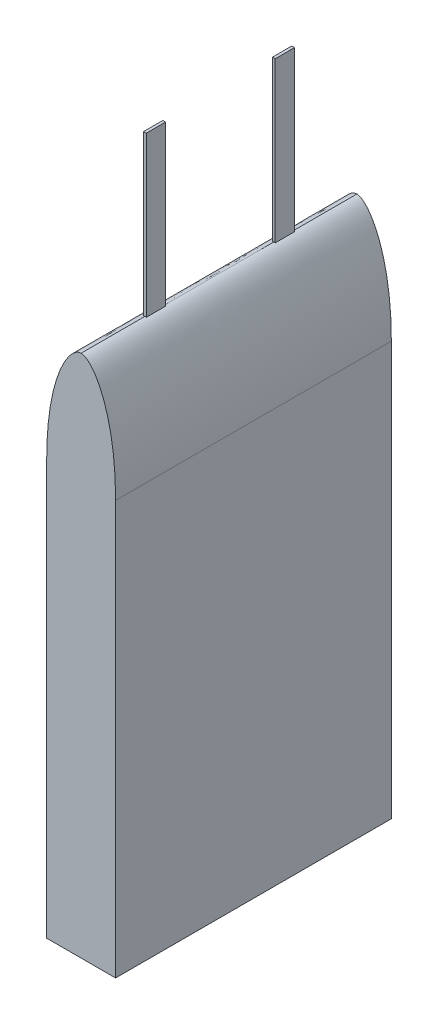
ISO-10303-21;
HEADER;
FILE_DESCRIPTION(('STEP AP214'),'2;1');
FILE_NAME('part.step','',(''),(''),'','','');
FILE_SCHEMA(('AUTOMOTIVE_DESIGN { 1 0 10303 214 1 1 1 1 }'));
ENDSEC;
DATA;
#1=APPLICATION_CONTEXT('core data for automotive mechanical design processes');
#2=APPLICATION_PROTOCOL_DEFINITION('international standard','automotive_design',2000,#1);
#3=PRODUCT_CONTEXT('',#1,'mechanical');
#4=PRODUCT('Part','Part','',(#3));
#5=PRODUCT_RELATED_PRODUCT_CATEGORY('part','',(#4));
#6=PRODUCT_DEFINITION_FORMATION('','',#4);
#7=PRODUCT_DEFINITION_CONTEXT('part definition',#1,'design');
#8=PRODUCT_DEFINITION('design','',#6,#7);
#9=PRODUCT_DEFINITION_SHAPE('','',#8);
#10=(LENGTH_UNIT() NAMED_UNIT(*) SI_UNIT(.MILLI.,.METRE.));
#11=(NAMED_UNIT(*) PLANE_ANGLE_UNIT() SI_UNIT($,.RADIAN.));
#12=(NAMED_UNIT(*) SI_UNIT($,.STERADIAN.) SOLID_ANGLE_UNIT());
#13=UNCERTAINTY_MEASURE_WITH_UNIT(LENGTH_MEASURE(1.E-05),#10,'distance_accuracy_value','');
#14=(GEOMETRIC_REPRESENTATION_CONTEXT(3) GLOBAL_UNCERTAINTY_ASSIGNED_CONTEXT((#13)) GLOBAL_UNIT_ASSIGNED_CONTEXT((#10,
#11,#12)) REPRESENTATION_CONTEXT('',''));
#15=CARTESIAN_POINT('',(0.,0.,0.));
#16=DIRECTION('',(0.,0.,1.));
#17=DIRECTION('',(1.,0.,0.));
#18=AXIS2_PLACEMENT_3D('',#15,#16,#17);
#19=CARTESIAN_POINT('',(5.,15.,-10.));
#20=DIRECTION('',(0.,0.,1.));
#21=DIRECTION('',(0.,-1.,0.));
#22=AXIS2_PLACEMENT_3D('',#19,#20,#21);
#23=PLANE('',#22);
#24=DIRECTION('',(0.,1.,0.));
#25=VECTOR('',#24,1.);
#26=CARTESIAN_POINT('',(0.,15.,-10.));
#27=LINE('',#26,#25);
#28=CARTESIAN_POINT('',(0.,-15.,-10.));
#29=VERTEX_POINT('',#28);
#30=CARTESIAN_POINT('',(0.,15.,-10.));
#31=VERTEX_POINT('',#30);
#32=EDGE_CURVE('E292',#29,#31,#27,.T.);
#33=ORIENTED_EDGE('',*,*,#32,.T.);
#34=CARTESIAN_POINT('',(2.5,22.9979471811532,-10.));
#35=CARTESIAN_POINT('',(1.66342165329432,22.9995894001905,-10.));
#36=CARTESIAN_POINT('',(-0.00576145306257891,20.5485259391372,-10.));
#37=CARTESIAN_POINT('',(0.,15.,-10.));
#38=B_SPLINE_CURVE_WITH_KNOTS('',3,(#34,#35,#36,#37),.UNSPECIFIED.,.F.,.F.,(4,4),(0.,1.),.UNSPECIFIED.);
#39=CARTESIAN_POINT('',(2.5,22.9979471811532,-10.));
#40=VERTEX_POINT('',#39);
#41=EDGE_CURVE('E230',#40,#31,#38,.T.);
#42=ORIENTED_EDGE('',*,*,#41,.F.);
#43=CARTESIAN_POINT('',(5.,15.,-10.));
#44=CARTESIAN_POINT('',(5.00576145306258,20.5485259391372,-10.));
#45=CARTESIAN_POINT('',(3.33657834670568,22.9995894001905,-10.));
#46=CARTESIAN_POINT('',(2.5,22.9979471811532,-10.));
#47=B_SPLINE_CURVE_WITH_KNOTS('',3,(#43,#44,#45,#46),.UNSPECIFIED.,.F.,.F.,(4,4),(0.,1.),.UNSPECIFIED.);
#48=CARTESIAN_POINT('',(5.,15.,-10.));
#49=VERTEX_POINT('',#48);
#50=EDGE_CURVE('E239',#49,#40,#47,.T.);
#51=ORIENTED_EDGE('',*,*,#50,.F.);
#52=DIRECTION('',(0.,1.,0.));
#53=VECTOR('',#52,1.);
#54=CARTESIAN_POINT('',(5.,15.,-10.));
#55=LINE('',#54,#53);
#56=CARTESIAN_POINT('',(5.,-15.,-10.));
#57=VERTEX_POINT('',#56);
#58=EDGE_CURVE('E293',#57,#49,#55,.T.);
#59=ORIENTED_EDGE('',*,*,#58,.F.);
#60=DIRECTION('',(-1.,0.,0.));
#61=VECTOR('',#60,1.);
#62=CARTESIAN_POINT('',(5.,-15.,-10.));
#63=LINE('',#62,#61);
#64=EDGE_CURVE('E288',#57,#29,#63,.T.);
#65=ORIENTED_EDGE('',*,*,#64,.T.);
#66=EDGE_LOOP('',(#33,#42,#51,#59,#65));
#67=FACE_BOUND('',#66,.T.);
#68=ADVANCED_FACE('F32',(#67),#23,.F.);
#69=CARTESIAN_POINT('',(5.,15.,10.));
#70=DIRECTION('',(0.,0.,-1.));
#71=DIRECTION('',(0.,1.,0.));
#72=AXIS2_PLACEMENT_3D('',#69,#70,#71);
#73=PLANE('',#72);
#74=DIRECTION('',(0.,-1.,0.));
#75=VECTOR('',#74,1.);
#76=CARTESIAN_POINT('',(0.,15.,10.));
#77=LINE('',#76,#75);
#78=CARTESIAN_POINT('',(0.,15.,10.));
#79=VERTEX_POINT('',#78);
#80=CARTESIAN_POINT('',(0.,-15.,10.));
#81=VERTEX_POINT('',#80);
#82=EDGE_CURVE('E273',#79,#81,#77,.T.);
#83=ORIENTED_EDGE('',*,*,#82,.T.);
#84=DIRECTION('',(-1.,0.,0.));
#85=VECTOR('',#84,1.);
#86=CARTESIAN_POINT('',(5.,-15.,10.));
#87=LINE('',#86,#85);
#88=CARTESIAN_POINT('',(5.,-15.,10.));
#89=VERTEX_POINT('',#88);
#90=EDGE_CURVE('E276',#89,#81,#87,.T.);
#91=ORIENTED_EDGE('',*,*,#90,.F.);
#92=DIRECTION('',(0.,-1.,0.));
#93=VECTOR('',#92,1.);
#94=CARTESIAN_POINT('',(5.,15.,10.));
#95=LINE('',#94,#93);
#96=CARTESIAN_POINT('',(5.,15.,10.));
#97=VERTEX_POINT('',#96);
#98=EDGE_CURVE('E343',#97,#89,#95,.T.);
#99=ORIENTED_EDGE('',*,*,#98,.F.);
#100=CARTESIAN_POINT('',(5.,15.,10.));
#101=CARTESIAN_POINT('',(5.00576145306258,20.5485259391372,10.));
#102=CARTESIAN_POINT('',(3.33657834670568,22.9995894001905,10.));
#103=CARTESIAN_POINT('',(2.5,22.9979471811532,10.));
#104=B_SPLINE_CURVE_WITH_KNOTS('',3,(#100,#101,#102,#103),.UNSPECIFIED.,.F.,.F.,(4,4),(0.,1.),.UNSPECIFIED.);
#105=CARTESIAN_POINT('',(2.5,22.9979471811532,10.));
#106=VERTEX_POINT('',#105);
#107=EDGE_CURVE('E222',#97,#106,#104,.T.);
#108=ORIENTED_EDGE('',*,*,#107,.T.);
#109=CARTESIAN_POINT('',(2.5,22.9979471811532,10.));
#110=CARTESIAN_POINT('',(1.66342165329432,22.9995894001905,10.));
#111=CARTESIAN_POINT('',(-0.00576145306257891,20.5485259391372,10.));
#112=CARTESIAN_POINT('',(0.,15.,10.));
#113=B_SPLINE_CURVE_WITH_KNOTS('',3,(#109,#110,#111,#112),.UNSPECIFIED.,.F.,.F.,(4,4),(0.,1.),.UNSPECIFIED.);
#114=EDGE_CURVE('E214',#106,#79,#113,.T.);
#115=ORIENTED_EDGE('',*,*,#114,.T.);
#116=EDGE_LOOP('',(#83,#91,#99,#108,#115));
#117=FACE_BOUND('',#116,.T.);
#118=ADVANCED_FACE('F264',(#117),#73,.F.);
#119=CARTESIAN_POINT('',(5.,-15.,10.));
#120=DIRECTION('',(0.,1.,0.));
#121=DIRECTION('',(0.,0.,1.));
#122=AXIS2_PLACEMENT_3D('',#119,#120,#121);
#123=PLANE('',#122);
#124=DIRECTION('',(0.,0.,-1.));
#125=VECTOR('',#124,1.);
#126=CARTESIAN_POINT('',(0.,-15.,10.));
#127=LINE('',#126,#125);
#128=EDGE_CURVE('E281',#81,#29,#127,.T.);
#129=ORIENTED_EDGE('',*,*,#128,.T.);
#130=ORIENTED_EDGE('',*,*,#64,.F.);
#131=DIRECTION('',(0.,0.,-1.));
#132=VECTOR('',#131,1.);
#133=CARTESIAN_POINT('',(5.,-15.,10.));
#134=LINE('',#133,#132);
#135=EDGE_CURVE('E286',#89,#57,#134,.T.);
#136=ORIENTED_EDGE('',*,*,#135,.F.);
#137=ORIENTED_EDGE('',*,*,#90,.T.);
#138=EDGE_LOOP('',(#129,#130,#136,#137));
#139=FACE_BOUND('',#138,.T.);
#140=ADVANCED_FACE('F258',(#139),#123,.F.);
#141=CARTESIAN_POINT('',(5.,0.,0.));
#142=DIRECTION('',(1.,0.,0.));
#143=DIRECTION('',(0.,0.,-1.));
#144=AXIS2_PLACEMENT_3D('',#141,#142,#143);
#145=PLANE('',#144);
#146=ORIENTED_EDGE('',*,*,#58,.T.);
#147=DIRECTION('',(0.,0.,1.));
#148=VECTOR('',#147,1.);
#149=CARTESIAN_POINT('',(5.,15.,10.));
#150=LINE('',#149,#148);
#151=EDGE_CURVE('E295',#49,#97,#150,.T.);
#152=ORIENTED_EDGE('',*,*,#151,.T.);
#153=ORIENTED_EDGE('',*,*,#98,.T.);
#154=ORIENTED_EDGE('',*,*,#135,.T.);
#155=EDGE_LOOP('',(#146,#152,#153,#154));
#156=FACE_BOUND('',#155,.T.);
#157=ADVANCED_FACE('F255',(#156),#145,.T.);
#158=CARTESIAN_POINT('',(0.,0.,0.));
#159=DIRECTION('',(1.,0.,0.));
#160=DIRECTION('',(0.,0.,-1.));
#161=AXIS2_PLACEMENT_3D('',#158,#159,#160);
#162=PLANE('',#161);
#163=ORIENTED_EDGE('',*,*,#32,.F.);
#164=ORIENTED_EDGE('',*,*,#128,.F.);
#165=ORIENTED_EDGE('',*,*,#82,.F.);
#166=DIRECTION('',(0.,0.,1.));
#167=VECTOR('',#166,1.);
#168=CARTESIAN_POINT('',(0.,15.,10.));
#169=LINE('',#168,#167);
#170=EDGE_CURVE('E282',#31,#79,#169,.T.);
#171=ORIENTED_EDGE('',*,*,#170,.F.);
#172=EDGE_LOOP('',(#163,#164,#165,#171));
#173=FACE_BOUND('',#172,.T.);
#174=ADVANCED_FACE('F253',(#173),#162,.F.);
#175=DIRECTION('',(0.,0.,1.));
#176=VECTOR('',#175,1.);
#177=SURFACE_OF_LINEAR_EXTRUSION('',#38,#176);
#178=CARTESIAN_POINT('',(2.5,22.9979471811532,3.97519149448997));
#179=CARTESIAN_POINT('',(1.66342165329432,22.9995894001905,3.97519149448997));
#180=CARTESIAN_POINT('',(-0.00576145306257891,20.5485259391372,3.97519149448997));
#181=CARTESIAN_POINT('',(0.,15.,3.97519149448997));
#182=B_SPLINE_CURVE_WITH_KNOTS('',3,(#178,#179,#180,#181),.UNSPECIFIED.,.F.,.F.,(4,4),(0.,1.),.UNSPECIFIED.);
#183=CARTESIAN_POINT('',(2.5,22.9979471811532,3.97519149448997));
#184=VERTEX_POINT('',#183);
#185=CARTESIAN_POINT('',(2.4,22.9872320805278,3.97519149448997));
#186=VERTEX_POINT('',#185);
#187=EDGE_CURVE('E171',#184,#186,#182,.T.);
#188=ORIENTED_EDGE('',*,*,#187,.F.);
#189=DIRECTION('',(0.,0.,1.));
#190=VECTOR('',#189,1.);
#191=CARTESIAN_POINT('',(2.5,22.9979471811532,-10.));
#192=LINE('',#191,#190);
#193=CARTESIAN_POINT('',(2.5,22.9979471811532,-3.97519149448997));
#194=VERTEX_POINT('',#193);
#195=EDGE_CURVE('E336',#194,#184,#192,.T.);
#196=ORIENTED_EDGE('',*,*,#195,.F.);
#197=CARTESIAN_POINT('',(2.5,22.9979471811532,-3.97519149448997));
#198=CARTESIAN_POINT('',(1.66342165329432,22.9995894001905,-3.97519149448997));
#199=CARTESIAN_POINT('',(-0.00576145306257891,20.5485259391372,-3.97519149448997));
#200=CARTESIAN_POINT('',(0.,15.,-3.97519149448997));
#201=B_SPLINE_CURVE_WITH_KNOTS('',3,(#197,#198,#199,#200),.UNSPECIFIED.,.F.,.F.,(4,4),(0.,1.),.UNSPECIFIED.);
#202=CARTESIAN_POINT('',(2.4,22.9872320805278,-3.97519149448997));
#203=VERTEX_POINT('',#202);
#204=EDGE_CURVE('E200',#203,#194,#201,.F.);
#205=ORIENTED_EDGE('',*,*,#204,.F.);
#206=DIRECTION('',(0.,0.,1.));
#207=VECTOR('',#206,1.);
#208=CARTESIAN_POINT('',(2.4,22.9872320805278,-10.));
#209=LINE('',#208,#207);
#210=CARTESIAN_POINT('',(2.4,22.9872320805278,-5.37525893909022));
#211=VERTEX_POINT('',#210);
#212=EDGE_CURVE('E54',#203,#211,#209,.F.);
#213=ORIENTED_EDGE('',*,*,#212,.T.);
#214=CARTESIAN_POINT('',(2.5,22.9979471811532,-5.37525893909022));
#215=CARTESIAN_POINT('',(1.66342165329432,22.9995894001905,-5.37525893909022));
#216=CARTESIAN_POINT('',(-0.00576145306257891,20.5485259391372,-5.37525893909022));
#217=CARTESIAN_POINT('',(0.,15.,-5.37525893909022));
#218=B_SPLINE_CURVE_WITH_KNOTS('',3,(#214,#215,#216,#217),.UNSPECIFIED.,.F.,.F.,(4,4),(0.,1.),.UNSPECIFIED.);
#219=CARTESIAN_POINT('',(2.5,22.9979471811532,-5.37525893909022));
#220=VERTEX_POINT('',#219);
#221=EDGE_CURVE('E207',#220,#211,#218,.T.);
#222=ORIENTED_EDGE('',*,*,#221,.F.);
#223=EDGE_CURVE('E338',#40,#220,#192,.T.);
#224=ORIENTED_EDGE('',*,*,#223,.F.);
#225=ORIENTED_EDGE('',*,*,#41,.T.);
#226=ORIENTED_EDGE('',*,*,#170,.T.);
#227=ORIENTED_EDGE('',*,*,#114,.F.);
#228=CARTESIAN_POINT('',(2.5,22.9979471811532,5.37525893909022));
#229=VERTEX_POINT('',#228);
#230=EDGE_CURVE('E339',#229,#106,#192,.T.);
#231=ORIENTED_EDGE('',*,*,#230,.F.);
#232=CARTESIAN_POINT('',(2.5,22.9979471811532,5.37525893909022));
#233=CARTESIAN_POINT('',(1.66342165329432,22.9995894001905,5.37525893909022));
#234=CARTESIAN_POINT('',(-0.00576145306257891,20.5485259391372,5.37525893909022));
#235=CARTESIAN_POINT('',(0.,15.,5.37525893909022));
#236=B_SPLINE_CURVE_WITH_KNOTS('',3,(#232,#233,#234,#235),.UNSPECIFIED.,.F.,.F.,(4,4),(0.,1.),.UNSPECIFIED.);
#237=CARTESIAN_POINT('',(2.4,22.9872320805278,5.37525893909022));
#238=VERTEX_POINT('',#237);
#239=EDGE_CURVE('E166',#238,#229,#236,.F.);
#240=ORIENTED_EDGE('',*,*,#239,.F.);
#241=DIRECTION('',(0.,0.,1.));
#242=VECTOR('',#241,1.);
#243=CARTESIAN_POINT('',(2.4,22.9872320805278,-10.));
#244=LINE('',#243,#242);
#245=EDGE_CURVE('E11',#186,#238,#244,.T.);
#246=ORIENTED_EDGE('',*,*,#245,.F.);
#247=EDGE_LOOP('',(#188,#196,#205,#213,#222,#224,#225,#226,#227,#231,#240,#246));
#248=FACE_BOUND('',#247,.T.);
#249=ADVANCED_FACE('F248',(#248),#177,.T.);
#250=DIRECTION('',(0.,0.,1.));
#251=VECTOR('',#250,1.);
#252=SURFACE_OF_LINEAR_EXTRUSION('',#47,#251);
#253=CARTESIAN_POINT('',(5.,15.,3.97519149448997));
#254=CARTESIAN_POINT('',(5.00576145306258,20.5485259391372,3.97519149448997));
#255=CARTESIAN_POINT('',(3.33657834670568,22.9995894001905,3.97519149448997));
#256=CARTESIAN_POINT('',(2.5,22.9979471811532,3.97519149448997));
#257=B_SPLINE_CURVE_WITH_KNOTS('',3,(#253,#254,#255,#256),.UNSPECIFIED.,.F.,.F.,(4,4),(0.,1.),.UNSPECIFIED.);
#258=CARTESIAN_POINT('',(2.6,22.9872320805278,3.97519149448997));
#259=VERTEX_POINT('',#258);
#260=EDGE_CURVE('E39',#259,#184,#257,.T.);
#261=ORIENTED_EDGE('',*,*,#260,.F.);
#262=DIRECTION('',(0.,0.,1.));
#263=VECTOR('',#262,1.);
#264=CARTESIAN_POINT('',(2.6,22.9872320805278,-10.));
#265=LINE('',#264,#263);
#266=CARTESIAN_POINT('',(2.6,22.9872320805278,5.37525893909022));
#267=VERTEX_POINT('',#266);
#268=EDGE_CURVE('E142',#259,#267,#265,.T.);
#269=ORIENTED_EDGE('',*,*,#268,.T.);
#270=CARTESIAN_POINT('',(5.,15.,5.37525893909022));
#271=CARTESIAN_POINT('',(5.00576145306258,20.5485259391372,5.37525893909022));
#272=CARTESIAN_POINT('',(3.33657834670568,22.9995894001905,5.37525893909022));
#273=CARTESIAN_POINT('',(2.5,22.9979471811532,5.37525893909022));
#274=B_SPLINE_CURVE_WITH_KNOTS('',3,(#270,#271,#272,#273),.UNSPECIFIED.,.F.,.F.,(4,4),(0.,1.),.UNSPECIFIED.);
#275=EDGE_CURVE('E320',#229,#267,#274,.F.);
#276=ORIENTED_EDGE('',*,*,#275,.F.);
#277=ORIENTED_EDGE('',*,*,#230,.T.);
#278=ORIENTED_EDGE('',*,*,#107,.F.);
#279=ORIENTED_EDGE('',*,*,#151,.F.);
#280=ORIENTED_EDGE('',*,*,#50,.T.);
#281=ORIENTED_EDGE('',*,*,#223,.T.);
#282=CARTESIAN_POINT('',(5.,15.,-5.37525893909022));
#283=CARTESIAN_POINT('',(5.00576145306258,20.5485259391372,-5.37525893909022));
#284=CARTESIAN_POINT('',(3.33657834670568,22.9995894001905,-5.37525893909022));
#285=CARTESIAN_POINT('',(2.5,22.9979471811532,-5.37525893909022));
#286=B_SPLINE_CURVE_WITH_KNOTS('',3,(#282,#283,#284,#285),.UNSPECIFIED.,.F.,.F.,(4,4),(0.,1.),.UNSPECIFIED.);
#287=CARTESIAN_POINT('',(2.6,22.9872320805278,-5.37525893909022));
#288=VERTEX_POINT('',#287);
#289=EDGE_CURVE('E307',#288,#220,#286,.T.);
#290=ORIENTED_EDGE('',*,*,#289,.F.);
#291=DIRECTION('',(0.,0.,1.));
#292=VECTOR('',#291,1.);
#293=CARTESIAN_POINT('',(2.6,22.9872320805278,-10.));
#294=LINE('',#293,#292);
#295=CARTESIAN_POINT('',(2.6,22.9872320805278,-3.97519149448997));
#296=VERTEX_POINT('',#295);
#297=EDGE_CURVE('E287',#296,#288,#294,.F.);
#298=ORIENTED_EDGE('',*,*,#297,.F.);
#299=CARTESIAN_POINT('',(5.,15.,-3.97519149448997));
#300=CARTESIAN_POINT('',(5.00576145306258,20.5485259391372,-3.97519149448997));
#301=CARTESIAN_POINT('',(3.33657834670568,22.9995894001905,-3.97519149448997));
#302=CARTESIAN_POINT('',(2.5,22.9979471811532,-3.97519149448997));
#303=B_SPLINE_CURVE_WITH_KNOTS('',3,(#299,#300,#301,#302),.UNSPECIFIED.,.F.,.F.,(4,4),(0.,1.),.UNSPECIFIED.);
#304=EDGE_CURVE('E302',#194,#296,#303,.F.);
#305=ORIENTED_EDGE('',*,*,#304,.F.);
#306=ORIENTED_EDGE('',*,*,#195,.T.);
#307=EDGE_LOOP('',(#261,#269,#276,#277,#278,#279,#280,#281,#290,#298,#305,#306));
#308=FACE_BOUND('',#307,.T.);
#309=ADVANCED_FACE('F252',(#308),#252,.T.);
#310=CARTESIAN_POINT('',(2.4,34.5564117060554,-5.37525893909022));
#311=DIRECTION('',(0.,0.,-1.));
#312=DIRECTION('',(-1.,0.,0.));
#313=AXIS2_PLACEMENT_3D('',#310,#311,#312);
#314=PLANE('',#313);
#315=ORIENTED_EDGE('',*,*,#289,.T.);
#316=ORIENTED_EDGE('',*,*,#221,.T.);
#317=DIRECTION('',(0.,1.,0.));
#318=VECTOR('',#317,1.);
#319=CARTESIAN_POINT('',(2.4,34.5564117060554,-5.37525893909022));
#320=LINE('',#319,#318);
#321=CARTESIAN_POINT('',(2.4,34.5564117060554,-5.37525893909022));
#322=VERTEX_POINT('',#321);
#323=EDGE_CURVE('E189',#211,#322,#320,.T.);
#324=ORIENTED_EDGE('',*,*,#323,.T.);
#325=DIRECTION('',(1.,0.,0.));
#326=VECTOR('',#325,1.);
#327=CARTESIAN_POINT('',(2.4,34.5564117060554,-5.37525893909022));
#328=LINE('',#327,#326);
#329=CARTESIAN_POINT('',(2.6,34.5564117060554,-5.37525893909022));
#330=VERTEX_POINT('',#329);
#331=EDGE_CURVE('E197',#322,#330,#328,.T.);
#332=ORIENTED_EDGE('',*,*,#331,.T.);
#333=DIRECTION('',(0.,1.,0.));
#334=VECTOR('',#333,1.);
#335=CARTESIAN_POINT('',(2.6,34.5564117060554,-5.37525893909022));
#336=LINE('',#335,#334);
#337=EDGE_CURVE('E178',#288,#330,#336,.T.);
#338=ORIENTED_EDGE('',*,*,#337,.F.);
#339=EDGE_LOOP('',(#315,#316,#324,#332,#338));
#340=FACE_BOUND('',#339,.T.);
#341=ADVANCED_FACE('F384',(#340),#314,.T.);
#342=CARTESIAN_POINT('',(2.4,34.5564117060554,-3.97519149448997));
#343=DIRECTION('',(0.,0.,1.));
#344=DIRECTION('',(1.,0.,0.));
#345=AXIS2_PLACEMENT_3D('',#342,#343,#344);
#346=PLANE('',#345);
#347=DIRECTION('',(0.,-1.,0.));
#348=VECTOR('',#347,1.);
#349=CARTESIAN_POINT('',(2.4,34.5564117060554,-3.97519149448997));
#350=LINE('',#349,#348);
#351=CARTESIAN_POINT('',(2.4,34.5564117060554,-3.97519149448997));
#352=VERTEX_POINT('',#351);
#353=EDGE_CURVE('E194',#352,#203,#350,.T.);
#354=ORIENTED_EDGE('',*,*,#353,.T.);
#355=ORIENTED_EDGE('',*,*,#204,.T.);
#356=ORIENTED_EDGE('',*,*,#304,.T.);
#357=DIRECTION('',(0.,-1.,0.));
#358=VECTOR('',#357,1.);
#359=CARTESIAN_POINT('',(2.6,34.5564117060554,-3.97519149448997));
#360=LINE('',#359,#358);
#361=CARTESIAN_POINT('',(2.6,34.5564117060554,-3.97519149448997));
#362=VERTEX_POINT('',#361);
#363=EDGE_CURVE('E186',#362,#296,#360,.T.);
#364=ORIENTED_EDGE('',*,*,#363,.F.);
#365=DIRECTION('',(1.,0.,0.));
#366=VECTOR('',#365,1.);
#367=CARTESIAN_POINT('',(2.4,34.5564117060554,-3.97519149448997));
#368=LINE('',#367,#366);
#369=EDGE_CURVE('E198',#352,#362,#368,.T.);
#370=ORIENTED_EDGE('',*,*,#369,.F.);
#371=EDGE_LOOP('',(#354,#355,#356,#364,#370));
#372=FACE_BOUND('',#371,.T.);
#373=ADVANCED_FACE('F381',(#372),#346,.T.);
#374=CARTESIAN_POINT('',(2.4,34.5564117060554,-3.97519149448997));
#375=DIRECTION('',(0.,1.,0.));
#376=DIRECTION('',(0.,0.,1.));
#377=AXIS2_PLACEMENT_3D('',#374,#375,#376);
#378=PLANE('',#377);
#379=ORIENTED_EDGE('',*,*,#369,.T.);
#380=DIRECTION('',(0.,0.,1.));
#381=VECTOR('',#380,1.);
#382=CARTESIAN_POINT('',(2.6,34.5564117060554,-3.97519149448997));
#383=LINE('',#382,#381);
#384=EDGE_CURVE('E183',#330,#362,#383,.T.);
#385=ORIENTED_EDGE('',*,*,#384,.F.);
#386=ORIENTED_EDGE('',*,*,#331,.F.);
#387=DIRECTION('',(0.,0.,1.));
#388=VECTOR('',#387,1.);
#389=CARTESIAN_POINT('',(2.4,34.5564117060554,-3.97519149448997));
#390=LINE('',#389,#388);
#391=EDGE_CURVE('E191',#322,#352,#390,.T.);
#392=ORIENTED_EDGE('',*,*,#391,.T.);
#393=EDGE_LOOP('',(#379,#385,#386,#392));
#394=FACE_BOUND('',#393,.T.);
#395=ADVANCED_FACE('F379',(#394),#378,.T.);
#396=CARTESIAN_POINT('',(2.4,0.,0.));
#397=DIRECTION('',(1.,0.,0.));
#398=DIRECTION('',(0.,0.,-1.));
#399=AXIS2_PLACEMENT_3D('',#396,#397,#398);
#400=PLANE('',#399);
#401=ORIENTED_EDGE('',*,*,#212,.F.);
#402=ORIENTED_EDGE('',*,*,#353,.F.);
#403=ORIENTED_EDGE('',*,*,#391,.F.);
#404=ORIENTED_EDGE('',*,*,#323,.F.);
#405=EDGE_LOOP('',(#401,#402,#403,#404));
#406=FACE_BOUND('',#405,.T.);
#407=ADVANCED_FACE('F375',(#406),#400,.F.);
#408=CARTESIAN_POINT('',(2.6,0.,0.));
#409=DIRECTION('',(1.,0.,0.));
#410=DIRECTION('',(0.,0.,-1.));
#411=AXIS2_PLACEMENT_3D('',#408,#409,#410);
#412=PLANE('',#411);
#413=ORIENTED_EDGE('',*,*,#363,.T.);
#414=ORIENTED_EDGE('',*,*,#297,.T.);
#415=ORIENTED_EDGE('',*,*,#337,.T.);
#416=ORIENTED_EDGE('',*,*,#384,.T.);
#417=EDGE_LOOP('',(#413,#414,#415,#416));
#418=FACE_BOUND('',#417,.T.);
#419=ADVANCED_FACE('F372',(#418),#412,.T.);
#420=CARTESIAN_POINT('',(2.4,34.5564117060554,3.97519149448997));
#421=DIRECTION('',(0.,0.,-1.));
#422=DIRECTION('',(-1.,0.,0.));
#423=AXIS2_PLACEMENT_3D('',#420,#421,#422);
#424=PLANE('',#423);
#425=ORIENTED_EDGE('',*,*,#260,.T.);
#426=ORIENTED_EDGE('',*,*,#187,.T.);
#427=DIRECTION('',(0.,1.,0.));
#428=VECTOR('',#427,1.);
#429=CARTESIAN_POINT('',(2.4,34.5564117060554,3.97519149448997));
#430=LINE('',#429,#428);
#431=CARTESIAN_POINT('',(2.4,34.5564117060554,3.97519149448997));
#432=VERTEX_POINT('',#431);
#433=EDGE_CURVE('E150',#186,#432,#430,.T.);
#434=ORIENTED_EDGE('',*,*,#433,.T.);
#435=DIRECTION('',(1.,0.,0.));
#436=VECTOR('',#435,1.);
#437=CARTESIAN_POINT('',(2.4,34.5564117060554,3.97519149448997));
#438=LINE('',#437,#436);
#439=CARTESIAN_POINT('',(2.6,34.5564117060554,3.97519149448997));
#440=VERTEX_POINT('',#439);
#441=EDGE_CURVE('E147',#432,#440,#438,.T.);
#442=ORIENTED_EDGE('',*,*,#441,.T.);
#443=DIRECTION('',(0.,1.,0.));
#444=VECTOR('',#443,1.);
#445=CARTESIAN_POINT('',(2.6,34.5564117060554,3.97519149448997));
#446=LINE('',#445,#444);
#447=EDGE_CURVE('E136',#259,#440,#446,.T.);
#448=ORIENTED_EDGE('',*,*,#447,.F.);
#449=EDGE_LOOP('',(#425,#426,#434,#442,#448));
#450=FACE_BOUND('',#449,.T.);
#451=ADVANCED_FACE('F148',(#450),#424,.T.);
#452=CARTESIAN_POINT('',(2.4,34.5564117060554,5.37525893909022));
#453=DIRECTION('',(0.,0.,1.));
#454=DIRECTION('',(1.,0.,0.));
#455=AXIS2_PLACEMENT_3D('',#452,#453,#454);
#456=PLANE('',#455);
#457=DIRECTION('',(0.,-1.,0.));
#458=VECTOR('',#457,1.);
#459=CARTESIAN_POINT('',(2.4,34.5564117060554,5.37525893909022));
#460=LINE('',#459,#458);
#461=CARTESIAN_POINT('',(2.4,34.5564117060554,5.37525893909022));
#462=VERTEX_POINT('',#461);
#463=EDGE_CURVE('E155',#462,#238,#460,.T.);
#464=ORIENTED_EDGE('',*,*,#463,.T.);
#465=ORIENTED_EDGE('',*,*,#239,.T.);
#466=ORIENTED_EDGE('',*,*,#275,.T.);
#467=DIRECTION('',(0.,-1.,0.));
#468=VECTOR('',#467,1.);
#469=CARTESIAN_POINT('',(2.6,34.5564117060554,5.37525893909022));
#470=LINE('',#469,#468);
#471=CARTESIAN_POINT('',(2.6,34.5564117060554,5.37525893909022));
#472=VERTEX_POINT('',#471);
#473=EDGE_CURVE('E46',#472,#267,#470,.T.);
#474=ORIENTED_EDGE('',*,*,#473,.F.);
#475=DIRECTION('',(1.,0.,0.));
#476=VECTOR('',#475,1.);
#477=CARTESIAN_POINT('',(2.4,34.5564117060554,5.37525893909022));
#478=LINE('',#477,#476);
#479=EDGE_CURVE('E154',#462,#472,#478,.T.);
#480=ORIENTED_EDGE('',*,*,#479,.F.);
#481=EDGE_LOOP('',(#464,#465,#466,#474,#480));
#482=FACE_BOUND('',#481,.T.);
#483=ADVANCED_FACE('F355',(#482),#456,.T.);
#484=CARTESIAN_POINT('',(2.4,34.5564117060554,3.97519149448997));
#485=DIRECTION('',(0.,1.,0.));
#486=DIRECTION('',(0.,0.,1.));
#487=AXIS2_PLACEMENT_3D('',#484,#485,#486);
#488=PLANE('',#487);
#489=ORIENTED_EDGE('',*,*,#479,.T.);
#490=DIRECTION('',(0.,0.,1.));
#491=VECTOR('',#490,1.);
#492=CARTESIAN_POINT('',(2.6,34.5564117060554,3.97519149448997));
#493=LINE('',#492,#491);
#494=EDGE_CURVE('E140',#440,#472,#493,.T.);
#495=ORIENTED_EDGE('',*,*,#494,.F.);
#496=ORIENTED_EDGE('',*,*,#441,.F.);
#497=DIRECTION('',(0.,0.,1.));
#498=VECTOR('',#497,1.);
#499=CARTESIAN_POINT('',(2.4,34.5564117060554,3.97519149448997));
#500=LINE('',#499,#498);
#501=EDGE_CURVE('E162',#432,#462,#500,.T.);
#502=ORIENTED_EDGE('',*,*,#501,.T.);
#503=EDGE_LOOP('',(#489,#495,#496,#502));
#504=FACE_BOUND('',#503,.T.);
#505=ADVANCED_FACE('F157',(#504),#488,.T.);
#506=CARTESIAN_POINT('',(2.4,0.,0.));
#507=DIRECTION('',(-1.,0.,0.));
#508=DIRECTION('',(0.,0.,1.));
#509=AXIS2_PLACEMENT_3D('',#506,#507,#508);
#510=PLANE('',#509);
#511=ORIENTED_EDGE('',*,*,#433,.F.);
#512=ORIENTED_EDGE('',*,*,#245,.T.);
#513=ORIENTED_EDGE('',*,*,#463,.F.);
#514=ORIENTED_EDGE('',*,*,#501,.F.);
#515=EDGE_LOOP('',(#511,#512,#513,#514));
#516=FACE_BOUND('',#515,.T.);
#517=ADVANCED_FACE('F358',(#516),#510,.T.);
#518=CARTESIAN_POINT('',(2.6,0.,0.));
#519=DIRECTION('',(-1.,0.,0.));
#520=DIRECTION('',(0.,0.,1.));
#521=AXIS2_PLACEMENT_3D('',#518,#519,#520);
#522=PLANE('',#521);
#523=ORIENTED_EDGE('',*,*,#268,.F.);
#524=ORIENTED_EDGE('',*,*,#447,.T.);
#525=ORIENTED_EDGE('',*,*,#494,.T.);
#526=ORIENTED_EDGE('',*,*,#473,.T.);
#527=EDGE_LOOP('',(#523,#524,#525,#526));
#528=FACE_BOUND('',#527,.T.);
#529=ADVANCED_FACE('F138',(#528),#522,.F.);
#530=CLOSED_SHELL('',(#68,#118,#140,#157,#174,#249,#309,#341,#373,#395,#407,#419,#451,#483,#505,
#517,#529));
#531=MANIFOLD_SOLID_BREP('B2',#530);
#532=ADVANCED_BREP_SHAPE_REPRESENTATION('',(#18,#531),#14);
#533=SHAPE_DEFINITION_REPRESENTATION(#9,#532);
ENDSEC;
END-ISO-10303-21;
